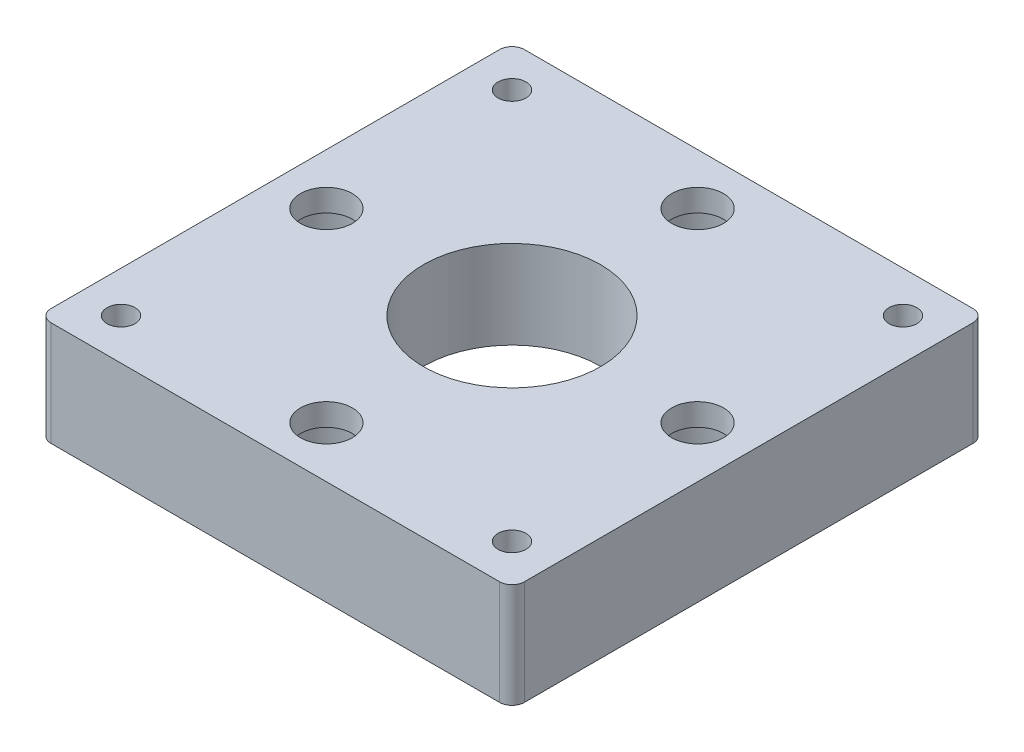
ISO-10303-21;
HEADER;
FILE_DESCRIPTION(('STEP AP214'),'2;1');
FILE_NAME('part.step','',(''),(''),'','','');
FILE_SCHEMA(('AUTOMOTIVE_DESIGN { 1 0 10303 214 1 1 1 1 }'));
ENDSEC;
DATA;
#1=APPLICATION_CONTEXT('core data for automotive mechanical design processes');
#2=APPLICATION_PROTOCOL_DEFINITION('international standard','automotive_design',2000,#1);
#3=PRODUCT_CONTEXT('',#1,'mechanical');
#4=PRODUCT('Part','Part','',(#3));
#5=PRODUCT_RELATED_PRODUCT_CATEGORY('part','',(#4));
#6=PRODUCT_DEFINITION_FORMATION('','',#4);
#7=PRODUCT_DEFINITION_CONTEXT('part definition',#1,'design');
#8=PRODUCT_DEFINITION('design','',#6,#7);
#9=PRODUCT_DEFINITION_SHAPE('','',#8);
#10=(LENGTH_UNIT() NAMED_UNIT(*) SI_UNIT(.MILLI.,.METRE.));
#11=(NAMED_UNIT(*) PLANE_ANGLE_UNIT() SI_UNIT($,.RADIAN.));
#12=(NAMED_UNIT(*) SI_UNIT($,.STERADIAN.) SOLID_ANGLE_UNIT());
#13=UNCERTAINTY_MEASURE_WITH_UNIT(LENGTH_MEASURE(1.E-05),#10,'distance_accuracy_value','');
#14=(GEOMETRIC_REPRESENTATION_CONTEXT(3) GLOBAL_UNCERTAINTY_ASSIGNED_CONTEXT((#13)) GLOBAL_UNIT_ASSIGNED_CONTEXT((#10,
#11,#12)) REPRESENTATION_CONTEXT('',''));
#15=CARTESIAN_POINT('',(0.,0.,0.));
#16=DIRECTION('',(0.,0.,1.));
#17=DIRECTION('',(1.,0.,0.));
#18=AXIS2_PLACEMENT_3D('',#15,#16,#17);
#19=CARTESIAN_POINT('',(0.,2.,0.));
#20=DIRECTION('',(0.,-1.,0.));
#21=DIRECTION('',(0.,0.,-1.));
#22=AXIS2_PLACEMENT_3D('',#19,#20,#21);
#23=CYLINDRICAL_SURFACE('',#22,19.);
#24=CARTESIAN_POINT('',(0.,2.,0.));
#25=DIRECTION('',(0.,-1.,0.));
#26=DIRECTION('',(0.,0.,-1.));
#27=AXIS2_PLACEMENT_3D('',#24,#25,#26);
#28=CIRCLE('',#27,19.);
#29=CARTESIAN_POINT('',(-3.83616697126879,2.,18.6087028824834));
#30=VERTEX_POINT('',#29);
#31=CARTESIAN_POINT('',(-18.6087028824833,2.,3.83616697126909));
#32=VERTEX_POINT('',#31);
#33=EDGE_CURVE('E179',#30,#32,#28,.T.);
#34=ORIENTED_EDGE('',*,*,#33,.F.);
#35=DIRECTION('',(0.,-1.,0.));
#36=VECTOR('',#35,1.);
#37=CARTESIAN_POINT('',(-3.83616697126879,5.,18.6087028824834));
#38=LINE('',#37,#36);
#39=CARTESIAN_POINT('',(-3.83616697126878,0.,18.6087028824834));
#40=VERTEX_POINT('',#39);
#41=EDGE_CURVE('E55',#30,#40,#38,.T.);
#42=ORIENTED_EDGE('',*,*,#41,.T.);
#43=CARTESIAN_POINT('',(0.,0.,0.));
#44=DIRECTION('',(0.,-1.,0.));
#45=DIRECTION('',(0.,0.,-1.));
#46=AXIS2_PLACEMENT_3D('',#43,#44,#45);
#47=CIRCLE('',#46,19.);
#48=CARTESIAN_POINT('',(-18.6087028824833,0.,3.8361669712691));
#49=VERTEX_POINT('',#48);
#50=EDGE_CURVE('E182',#40,#49,#47,.T.);
#51=ORIENTED_EDGE('',*,*,#50,.T.);
#52=DIRECTION('',(0.,-1.,0.));
#53=VECTOR('',#52,1.);
#54=CARTESIAN_POINT('',(-18.6087028824833,5.,3.8361669712691));
#55=LINE('',#54,#53);
#56=EDGE_CURVE('E211',#49,#32,#55,.F.);
#57=ORIENTED_EDGE('',*,*,#56,.T.);
#58=EDGE_LOOP('',(#34,#42,#51,#57));
#59=FACE_BOUND('',#58,.T.);
#60=ADVANCED_FACE('F33',(#59),#23,.F.);
#61=CARTESIAN_POINT('',(-18.6087028824834,2.,-3.83616697126883));
#62=VERTEX_POINT('',#61);
#63=CARTESIAN_POINT('',(-3.83616697126905,2.,-18.6087028824834));
#64=VERTEX_POINT('',#63);
#65=EDGE_CURVE('E174',#62,#64,#28,.T.);
#66=ORIENTED_EDGE('',*,*,#65,.F.);
#67=DIRECTION('',(0.,-1.,0.));
#68=VECTOR('',#67,1.);
#69=CARTESIAN_POINT('',(-18.6087028824834,5.,-3.83616697126884));
#70=LINE('',#69,#68);
#71=CARTESIAN_POINT('',(-18.6087028824834,0.,-3.83616697126884));
#72=VERTEX_POINT('',#71);
#73=EDGE_CURVE('E48',#62,#72,#70,.T.);
#74=ORIENTED_EDGE('',*,*,#73,.T.);
#75=CARTESIAN_POINT('',(-3.83616697126904,0.,-18.6087028824834));
#76=VERTEX_POINT('',#75);
#77=EDGE_CURVE('E177',#72,#76,#47,.T.);
#78=ORIENTED_EDGE('',*,*,#77,.T.);
#79=DIRECTION('',(0.,-1.,0.));
#80=VECTOR('',#79,1.);
#81=CARTESIAN_POINT('',(-3.83616697126904,5.,-18.6087028824834));
#82=LINE('',#81,#80);
#83=EDGE_CURVE('E150',#76,#64,#82,.F.);
#84=ORIENTED_EDGE('',*,*,#83,.T.);
#85=EDGE_LOOP('',(#66,#74,#78,#84));
#86=FACE_BOUND('',#85,.T.);
#87=ADVANCED_FACE('F348',(#86),#23,.F.);
#88=CARTESIAN_POINT('',(18.6087028824834,0.,3.83616697126897));
#89=VERTEX_POINT('',#88);
#90=CARTESIAN_POINT('',(3.83616697126917,0.,18.6087028824833));
#91=VERTEX_POINT('',#90);
#92=EDGE_CURVE('E175',#89,#91,#47,.T.);
#93=ORIENTED_EDGE('',*,*,#92,.T.);
#94=DIRECTION('',(0.,-1.,0.));
#95=VECTOR('',#94,1.);
#96=CARTESIAN_POINT('',(3.83616697126917,5.,18.6087028824833));
#97=LINE('',#96,#95);
#98=CARTESIAN_POINT('',(3.83616697126918,2.,18.6087028824833));
#99=VERTEX_POINT('',#98);
#100=EDGE_CURVE('E215',#91,#99,#97,.F.);
#101=ORIENTED_EDGE('',*,*,#100,.T.);
#102=CARTESIAN_POINT('',(18.6087028824834,2.,3.83616697126896));
#103=VERTEX_POINT('',#102);
#104=EDGE_CURVE('E197',#103,#99,#28,.T.);
#105=ORIENTED_EDGE('',*,*,#104,.F.);
#106=DIRECTION('',(0.,-1.,0.));
#107=VECTOR('',#106,1.);
#108=CARTESIAN_POINT('',(18.6087028824834,5.,3.83616697126897));
#109=LINE('',#108,#107);
#110=EDGE_CURVE('E213',#103,#89,#109,.T.);
#111=ORIENTED_EDGE('',*,*,#110,.T.);
#112=EDGE_LOOP('',(#93,#101,#105,#111));
#113=FACE_BOUND('',#112,.T.);
#114=ADVANCED_FACE('F222',(#113),#23,.F.);
#115=CARTESIAN_POINT('',(27.25,12.7,-27.25));
#116=DIRECTION('',(0.,-1.,0.));
#117=DIRECTION('',(0.,0.,-1.));
#118=AXIS2_PLACEMENT_3D('',#115,#116,#117);
#119=CYLINDRICAL_SURFACE('',#118,1.5);
#120=CARTESIAN_POINT('',(27.25,0.,-27.25));
#121=DIRECTION('',(0.,1.,0.));
#122=DIRECTION('',(0.,0.,1.));
#123=AXIS2_PLACEMENT_3D('',#120,#121,#122);
#124=CIRCLE('',#123,1.5);
#125=CARTESIAN_POINT('',(28.75,0.,-27.25));
#126=VERTEX_POINT('',#125);
#127=CARTESIAN_POINT('',(27.25,0.,-28.75));
#128=VERTEX_POINT('',#127);
#129=EDGE_CURVE('E290',#126,#128,#124,.T.);
#130=ORIENTED_EDGE('',*,*,#129,.T.);
#131=DIRECTION('',(0.,-1.,0.));
#132=VECTOR('',#131,1.);
#133=CARTESIAN_POINT('',(27.25,12.7,-28.75));
#134=LINE('',#133,#132);
#135=CARTESIAN_POINT('',(27.25,12.7,-28.75));
#136=VERTEX_POINT('',#135);
#137=EDGE_CURVE('E248',#136,#128,#134,.T.);
#138=ORIENTED_EDGE('',*,*,#137,.F.);
#139=CARTESIAN_POINT('',(27.25,12.7,-27.25));
#140=DIRECTION('',(0.,1.,0.));
#141=DIRECTION('',(0.,0.,1.));
#142=AXIS2_PLACEMENT_3D('',#139,#140,#141);
#143=CIRCLE('',#142,1.5);
#144=CARTESIAN_POINT('',(28.75,12.7,-27.25));
#145=VERTEX_POINT('',#144);
#146=EDGE_CURVE('E273',#145,#136,#143,.T.);
#147=ORIENTED_EDGE('',*,*,#146,.F.);
#148=DIRECTION('',(0.,-1.,0.));
#149=VECTOR('',#148,1.);
#150=CARTESIAN_POINT('',(28.75,12.7,-27.25));
#151=LINE('',#150,#149);
#152=EDGE_CURVE('E267',#145,#126,#151,.T.);
#153=ORIENTED_EDGE('',*,*,#152,.T.);
#154=EDGE_LOOP('',(#130,#138,#147,#153));
#155=FACE_BOUND('',#154,.T.);
#156=ADVANCED_FACE('F35',(#155),#119,.T.);
#157=CARTESIAN_POINT('',(27.25,12.7,-28.75));
#158=DIRECTION('',(0.,0.,1.));
#159=DIRECTION('',(1.,0.,0.));
#160=AXIS2_PLACEMENT_3D('',#157,#158,#159);
#161=PLANE('',#160);
#162=DIRECTION('',(-1.,0.,0.));
#163=VECTOR('',#162,1.);
#164=CARTESIAN_POINT('',(27.25,0.,-28.75));
#165=LINE('',#164,#163);
#166=CARTESIAN_POINT('',(-27.25,0.,-28.75));
#167=VERTEX_POINT('',#166);
#168=EDGE_CURVE('E287',#128,#167,#165,.T.);
#169=ORIENTED_EDGE('',*,*,#168,.T.);
#170=DIRECTION('',(0.,-1.,0.));
#171=VECTOR('',#170,1.);
#172=CARTESIAN_POINT('',(-27.25,12.7,-28.75));
#173=LINE('',#172,#171);
#174=CARTESIAN_POINT('',(-27.25,12.7,-28.75));
#175=VERTEX_POINT('',#174);
#176=EDGE_CURVE('E253',#175,#167,#173,.T.);
#177=ORIENTED_EDGE('',*,*,#176,.F.);
#178=DIRECTION('',(-1.,0.,0.));
#179=VECTOR('',#178,1.);
#180=CARTESIAN_POINT('',(27.25,12.7,-28.75));
#181=LINE('',#180,#179);
#182=EDGE_CURVE('E307',#136,#175,#181,.T.);
#183=ORIENTED_EDGE('',*,*,#182,.F.);
#184=ORIENTED_EDGE('',*,*,#137,.T.);
#185=EDGE_LOOP('',(#169,#177,#183,#184));
#186=FACE_BOUND('',#185,.T.);
#187=ADVANCED_FACE('F405',(#186),#161,.F.);
#188=CARTESIAN_POINT('',(-27.25,12.7,-27.25));
#189=DIRECTION('',(0.,-1.,0.));
#190=DIRECTION('',(0.,0.,-1.));
#191=AXIS2_PLACEMENT_3D('',#188,#189,#190);
#192=CYLINDRICAL_SURFACE('',#191,1.50000000000001);
#193=CARTESIAN_POINT('',(-27.25,0.,-27.25));
#194=DIRECTION('',(0.,-1.,0.));
#195=DIRECTION('',(0.,0.,-1.));
#196=AXIS2_PLACEMENT_3D('',#193,#194,#195);
#197=CIRCLE('',#196,1.50000000000001);
#198=CARTESIAN_POINT('',(-28.75,0.,-27.25));
#199=VERTEX_POINT('',#198);
#200=EDGE_CURVE('E284',#199,#167,#197,.T.);
#201=ORIENTED_EDGE('',*,*,#200,.F.);
#202=DIRECTION('',(0.,-1.,0.));
#203=VECTOR('',#202,1.);
#204=CARTESIAN_POINT('',(-28.75,12.7,-27.25));
#205=LINE('',#204,#203);
#206=CARTESIAN_POINT('',(-28.75,12.7,-27.25));
#207=VERTEX_POINT('',#206);
#208=EDGE_CURVE('E255',#207,#199,#205,.T.);
#209=ORIENTED_EDGE('',*,*,#208,.F.);
#210=CARTESIAN_POINT('',(-27.25,12.7,-27.25));
#211=DIRECTION('',(0.,-1.,0.));
#212=DIRECTION('',(0.,0.,-1.));
#213=AXIS2_PLACEMENT_3D('',#210,#211,#212);
#214=CIRCLE('',#213,1.50000000000001);
#215=EDGE_CURVE('E304',#207,#175,#214,.T.);
#216=ORIENTED_EDGE('',*,*,#215,.T.);
#217=ORIENTED_EDGE('',*,*,#176,.T.);
#218=EDGE_LOOP('',(#201,#209,#216,#217));
#219=FACE_BOUND('',#218,.T.);
#220=ADVANCED_FACE('F401',(#219),#192,.T.);
#221=CARTESIAN_POINT('',(-28.75,12.7,-27.25));
#222=DIRECTION('',(1.,0.,0.));
#223=DIRECTION('',(0.,0.,-1.));
#224=AXIS2_PLACEMENT_3D('',#221,#222,#223);
#225=PLANE('',#224);
#226=DIRECTION('',(0.,0.,1.));
#227=VECTOR('',#226,1.);
#228=CARTESIAN_POINT('',(-28.75,0.,-27.25));
#229=LINE('',#228,#227);
#230=CARTESIAN_POINT('',(-28.75,0.,27.25));
#231=VERTEX_POINT('',#230);
#232=EDGE_CURVE('E281',#199,#231,#229,.T.);
#233=ORIENTED_EDGE('',*,*,#232,.T.);
#234=DIRECTION('',(0.,-1.,0.));
#235=VECTOR('',#234,1.);
#236=CARTESIAN_POINT('',(-28.75,12.7,27.25));
#237=LINE('',#236,#235);
#238=CARTESIAN_POINT('',(-28.75,12.7,27.25));
#239=VERTEX_POINT('',#238);
#240=EDGE_CURVE('E257',#239,#231,#237,.T.);
#241=ORIENTED_EDGE('',*,*,#240,.F.);
#242=DIRECTION('',(0.,0.,1.));
#243=VECTOR('',#242,1.);
#244=CARTESIAN_POINT('',(-28.75,12.7,-27.25));
#245=LINE('',#244,#243);
#246=EDGE_CURVE('E302',#207,#239,#245,.T.);
#247=ORIENTED_EDGE('',*,*,#246,.F.);
#248=ORIENTED_EDGE('',*,*,#208,.T.);
#249=EDGE_LOOP('',(#233,#241,#247,#248));
#250=FACE_BOUND('',#249,.T.);
#251=ADVANCED_FACE('F398',(#250),#225,.F.);
#252=CARTESIAN_POINT('',(-27.25,12.7,27.25));
#253=DIRECTION('',(0.,-1.,0.));
#254=DIRECTION('',(0.,0.,-1.));
#255=AXIS2_PLACEMENT_3D('',#252,#253,#254);
#256=CYLINDRICAL_SURFACE('',#255,1.5);
#257=CARTESIAN_POINT('',(-27.25,0.,27.25));
#258=DIRECTION('',(0.,-1.,0.));
#259=DIRECTION('',(0.,0.,-1.));
#260=AXIS2_PLACEMENT_3D('',#257,#258,#259);
#261=CIRCLE('',#260,1.5);
#262=CARTESIAN_POINT('',(-27.25,0.,28.75));
#263=VERTEX_POINT('',#262);
#264=EDGE_CURVE('E278',#263,#231,#261,.T.);
#265=ORIENTED_EDGE('',*,*,#264,.F.);
#266=DIRECTION('',(0.,-1.,0.));
#267=VECTOR('',#266,1.);
#268=CARTESIAN_POINT('',(-27.25,12.7,28.75));
#269=LINE('',#268,#267);
#270=CARTESIAN_POINT('',(-27.25,12.7,28.75));
#271=VERTEX_POINT('',#270);
#272=EDGE_CURVE('E259',#271,#263,#269,.T.);
#273=ORIENTED_EDGE('',*,*,#272,.F.);
#274=CARTESIAN_POINT('',(-27.25,12.7,27.25));
#275=DIRECTION('',(0.,-1.,0.));
#276=DIRECTION('',(0.,0.,-1.));
#277=AXIS2_PLACEMENT_3D('',#274,#275,#276);
#278=CIRCLE('',#277,1.5);
#279=EDGE_CURVE('E299',#271,#239,#278,.T.);
#280=ORIENTED_EDGE('',*,*,#279,.T.);
#281=ORIENTED_EDGE('',*,*,#240,.T.);
#282=EDGE_LOOP('',(#265,#273,#280,#281));
#283=FACE_BOUND('',#282,.T.);
#284=ADVANCED_FACE('F392',(#283),#256,.T.);
#285=CARTESIAN_POINT('',(-27.25,12.7,28.75));
#286=DIRECTION('',(0.,0.,-1.));
#287=DIRECTION('',(-1.,0.,0.));
#288=AXIS2_PLACEMENT_3D('',#285,#286,#287);
#289=PLANE('',#288);
#290=DIRECTION('',(1.,0.,0.));
#291=VECTOR('',#290,1.);
#292=CARTESIAN_POINT('',(-27.25,0.,28.75));
#293=LINE('',#292,#291);
#294=CARTESIAN_POINT('',(27.25,0.,28.75));
#295=VERTEX_POINT('',#294);
#296=EDGE_CURVE('E276',#263,#295,#293,.T.);
#297=ORIENTED_EDGE('',*,*,#296,.T.);
#298=DIRECTION('',(0.,-1.,0.));
#299=VECTOR('',#298,1.);
#300=CARTESIAN_POINT('',(27.25,12.7,28.75));
#301=LINE('',#300,#299);
#302=CARTESIAN_POINT('',(27.25,12.7,28.75));
#303=VERTEX_POINT('',#302);
#304=EDGE_CURVE('E261',#303,#295,#301,.T.);
#305=ORIENTED_EDGE('',*,*,#304,.F.);
#306=DIRECTION('',(1.,0.,0.));
#307=VECTOR('',#306,1.);
#308=CARTESIAN_POINT('',(-27.25,12.7,28.75));
#309=LINE('',#308,#307);
#310=EDGE_CURVE('E297',#271,#303,#309,.T.);
#311=ORIENTED_EDGE('',*,*,#310,.F.);
#312=ORIENTED_EDGE('',*,*,#272,.T.);
#313=EDGE_LOOP('',(#297,#305,#311,#312));
#314=FACE_BOUND('',#313,.T.);
#315=ADVANCED_FACE('F407',(#314),#289,.F.);
#316=CARTESIAN_POINT('',(27.25,12.7,27.25));
#317=DIRECTION('',(0.,-1.,0.));
#318=DIRECTION('',(0.,0.,-1.));
#319=AXIS2_PLACEMENT_3D('',#316,#317,#318);
#320=CYLINDRICAL_SURFACE('',#319,1.5);
#321=CARTESIAN_POINT('',(27.25,0.,27.25));
#322=DIRECTION('',(0.,1.,0.));
#323=DIRECTION('',(0.,0.,1.));
#324=AXIS2_PLACEMENT_3D('',#321,#322,#323);
#325=CIRCLE('',#324,1.5);
#326=CARTESIAN_POINT('',(28.75,0.,27.25));
#327=VERTEX_POINT('',#326);
#328=EDGE_CURVE('E274',#295,#327,#325,.T.);
#329=ORIENTED_EDGE('',*,*,#328,.T.);
#330=DIRECTION('',(0.,-1.,0.));
#331=VECTOR('',#330,1.);
#332=CARTESIAN_POINT('',(28.75,12.7,27.25));
#333=LINE('',#332,#331);
#334=CARTESIAN_POINT('',(28.75,12.7,27.25));
#335=VERTEX_POINT('',#334);
#336=EDGE_CURVE('E264',#335,#327,#333,.T.);
#337=ORIENTED_EDGE('',*,*,#336,.F.);
#338=CARTESIAN_POINT('',(27.25,12.7,27.25));
#339=DIRECTION('',(0.,1.,0.));
#340=DIRECTION('',(0.,0.,1.));
#341=AXIS2_PLACEMENT_3D('',#338,#339,#340);
#342=CIRCLE('',#341,1.5);
#343=EDGE_CURVE('E295',#303,#335,#342,.T.);
#344=ORIENTED_EDGE('',*,*,#343,.F.);
#345=ORIENTED_EDGE('',*,*,#304,.T.);
#346=EDGE_LOOP('',(#329,#337,#344,#345));
#347=FACE_BOUND('',#346,.T.);
#348=ADVANCED_FACE('F385',(#347),#320,.T.);
#349=CARTESIAN_POINT('',(28.75,12.7,27.25));
#350=DIRECTION('',(-1.,0.,0.));
#351=DIRECTION('',(0.,0.,1.));
#352=AXIS2_PLACEMENT_3D('',#349,#350,#351);
#353=PLANE('',#352);
#354=DIRECTION('',(0.,0.,-1.));
#355=VECTOR('',#354,1.);
#356=CARTESIAN_POINT('',(28.75,0.,27.25));
#357=LINE('',#356,#355);
#358=EDGE_CURVE('E271',#327,#126,#357,.T.);
#359=ORIENTED_EDGE('',*,*,#358,.T.);
#360=ORIENTED_EDGE('',*,*,#152,.F.);
#361=DIRECTION('',(0.,0.,-1.));
#362=VECTOR('',#361,1.);
#363=CARTESIAN_POINT('',(28.75,12.7,27.25));
#364=LINE('',#363,#362);
#365=EDGE_CURVE('E270',#335,#145,#364,.T.);
#366=ORIENTED_EDGE('',*,*,#365,.F.);
#367=ORIENTED_EDGE('',*,*,#336,.T.);
#368=EDGE_LOOP('',(#359,#360,#366,#367));
#369=FACE_BOUND('',#368,.T.);
#370=ADVANCED_FACE('F381',(#369),#353,.F.);
#371=CARTESIAN_POINT('',(27.25,12.7,-27.25));
#372=DIRECTION('',(0.,1.,0.));
#373=DIRECTION('',(0.,0.,1.));
#374=AXIS2_PLACEMENT_3D('',#371,#372,#373);
#375=PLANE('',#374);
#376=CARTESIAN_POINT('',(22.55,12.7,0.));
#377=DIRECTION('',(0.,-1.,0.));
#378=DIRECTION('',(0.,0.,-1.));
#379=AXIS2_PLACEMENT_3D('',#376,#377,#378);
#380=CIRCLE('',#379,3.15);
#381=CARTESIAN_POINT('',(22.55,12.7,-3.15));
#382=VERTEX_POINT('',#381);
#383=EDGE_CURVE('E242',#382,#382,#380,.T.);
#384=ORIENTED_EDGE('',*,*,#383,.T.);
#385=EDGE_LOOP('',(#384));
#386=FACE_BOUND('',#385,.T.);
#387=CARTESIAN_POINT('',(0.,12.7,-22.55));
#388=DIRECTION('',(0.,-1.,0.));
#389=DIRECTION('',(0.,0.,-1.));
#390=AXIS2_PLACEMENT_3D('',#387,#388,#389);
#391=CIRCLE('',#390,3.15);
#392=CARTESIAN_POINT('',(0.,12.7,-25.7));
#393=VERTEX_POINT('',#392);
#394=EDGE_CURVE('E654',#393,#393,#391,.T.);
#395=ORIENTED_EDGE('',*,*,#394,.T.);
#396=EDGE_LOOP('',(#395));
#397=FACE_BOUND('',#396,.T.);
#398=CARTESIAN_POINT('',(-22.55,12.7,1.57465808381825E-13));
#399=DIRECTION('',(0.,-1.,0.));
#400=DIRECTION('',(0.,0.,-1.));
#401=AXIS2_PLACEMENT_3D('',#398,#399,#400);
#402=CIRCLE('',#401,3.15);
#403=CARTESIAN_POINT('',(-22.55,12.7,-3.14999999999984));
#404=VERTEX_POINT('',#403);
#405=EDGE_CURVE('E655',#404,#404,#402,.T.);
#406=ORIENTED_EDGE('',*,*,#405,.T.);
#407=EDGE_LOOP('',(#406));
#408=FACE_BOUND('',#407,.T.);
#409=CARTESIAN_POINT('',(2.36198712572738E-13,12.7,22.55));
#410=DIRECTION('',(0.,-1.,0.));
#411=DIRECTION('',(0.,0.,-1.));
#412=AXIS2_PLACEMENT_3D('',#409,#410,#411);
#413=CIRCLE('',#412,3.15);
#414=CARTESIAN_POINT('',(2.36198712572738E-13,12.7,19.4));
#415=VERTEX_POINT('',#414);
#416=EDGE_CURVE('E667',#415,#415,#413,.T.);
#417=ORIENTED_EDGE('',*,*,#416,.T.);
#418=EDGE_LOOP('',(#417));
#419=FACE_BOUND('',#418,.T.);
#420=CARTESIAN_POINT('',(0.,12.7,0.));
#421=DIRECTION('',(0.,-1.,0.));
#422=DIRECTION('',(0.,0.,-1.));
#423=AXIS2_PLACEMENT_3D('',#420,#421,#422);
#424=CIRCLE('',#423,10.75);
#425=CARTESIAN_POINT('',(0.,12.7,-10.75));
#426=VERTEX_POINT('',#425);
#427=EDGE_CURVE('E184',#426,#426,#424,.T.);
#428=ORIENTED_EDGE('',*,*,#427,.T.);
#429=EDGE_LOOP('',(#428));
#430=FACE_BOUND('',#429,.T.);
#431=CARTESIAN_POINT('',(-23.75,12.7,-23.7500000000003));
#432=DIRECTION('',(0.,1.,0.));
#433=DIRECTION('',(0.,0.,1.));
#434=AXIS2_PLACEMENT_3D('',#431,#432,#433);
#435=CIRCLE('',#434,1.69379628197264);
#436=CARTESIAN_POINT('',(-23.75,12.7,-22.0562037180276));
#437=VERTEX_POINT('',#436);
#438=EDGE_CURVE('E293',#437,#437,#435,.F.);
#439=ORIENTED_EDGE('',*,*,#438,.T.);
#440=EDGE_LOOP('',(#439));
#441=FACE_BOUND('',#440,.T.);
#442=CARTESIAN_POINT('',(23.75,12.7,23.7500000000003));
#443=DIRECTION('',(0.,1.,0.));
#444=DIRECTION('',(0.,0.,1.));
#445=AXIS2_PLACEMENT_3D('',#442,#443,#444);
#446=CIRCLE('',#445,1.69379628197264);
#447=CARTESIAN_POINT('',(23.75,12.7,25.4437962819729));
#448=VERTEX_POINT('',#447);
#449=EDGE_CURVE('E313',#448,#448,#446,.F.);
#450=ORIENTED_EDGE('',*,*,#449,.T.);
#451=EDGE_LOOP('',(#450));
#452=FACE_BOUND('',#451,.T.);
#453=CARTESIAN_POINT('',(-23.75,12.7,23.7500000000003));
#454=DIRECTION('',(0.,1.,0.));
#455=DIRECTION('',(0.,0.,1.));
#456=AXIS2_PLACEMENT_3D('',#453,#454,#455);
#457=CIRCLE('',#456,1.69379628197264);
#458=CARTESIAN_POINT('',(-23.75,12.7,25.4437962819729));
#459=VERTEX_POINT('',#458);
#460=EDGE_CURVE('E316',#459,#459,#457,.F.);
#461=ORIENTED_EDGE('',*,*,#460,.T.);
#462=EDGE_LOOP('',(#461));
#463=FACE_BOUND('',#462,.T.);
#464=CARTESIAN_POINT('',(23.75,12.7,-23.7500000000003));
#465=DIRECTION('',(0.,1.,0.));
#466=DIRECTION('',(0.,0.,1.));
#467=AXIS2_PLACEMENT_3D('',#464,#465,#466);
#468=CIRCLE('',#467,1.69379628197264);
#469=CARTESIAN_POINT('',(23.75,12.7,-22.0562037180276));
#470=VERTEX_POINT('',#469);
#471=EDGE_CURVE('E319',#470,#470,#468,.F.);
#472=ORIENTED_EDGE('',*,*,#471,.T.);
#473=EDGE_LOOP('',(#472));
#474=FACE_BOUND('',#473,.T.);
#475=ORIENTED_EDGE('',*,*,#146,.T.);
#476=ORIENTED_EDGE('',*,*,#182,.T.);
#477=ORIENTED_EDGE('',*,*,#215,.F.);
#478=ORIENTED_EDGE('',*,*,#246,.T.);
#479=ORIENTED_EDGE('',*,*,#279,.F.);
#480=ORIENTED_EDGE('',*,*,#310,.T.);
#481=ORIENTED_EDGE('',*,*,#343,.T.);
#482=ORIENTED_EDGE('',*,*,#365,.T.);
#483=EDGE_LOOP('',(#475,#476,#477,#478,#479,#480,#481,#482));
#484=FACE_BOUND('',#483,.T.);
#485=ADVANCED_FACE('F368',(#386,#397,#408,#419,#430,#441,#452,#463,#474,#484),#375,.T.);
#486=CARTESIAN_POINT('',(27.25,0.,-27.25));
#487=DIRECTION('',(0.,1.,0.));
#488=DIRECTION('',(0.,0.,1.));
#489=AXIS2_PLACEMENT_3D('',#486,#487,#488);
#490=PLANE('',#489);
#491=ORIENTED_EDGE('',*,*,#50,.F.);
#492=CARTESIAN_POINT('',(2.36198712572738E-13,0.,22.55));
#493=DIRECTION('',(0.,-1.,0.));
#494=DIRECTION('',(0.,0.,-1.));
#495=AXIS2_PLACEMENT_3D('',#492,#493,#494);
#496=CIRCLE('',#495,5.5);
#497=EDGE_CURVE('E225',#91,#40,#496,.T.);
#498=ORIENTED_EDGE('',*,*,#497,.F.);
#499=ORIENTED_EDGE('',*,*,#92,.F.);
#500=CARTESIAN_POINT('',(22.55,0.,0.));
#501=DIRECTION('',(0.,-1.,0.));
#502=DIRECTION('',(0.,0.,-1.));
#503=AXIS2_PLACEMENT_3D('',#500,#501,#502);
#504=CIRCLE('',#503,5.5);
#505=CARTESIAN_POINT('',(18.6087028824834,0.,-3.83616697126897));
#506=VERTEX_POINT('',#505);
#507=EDGE_CURVE('E173',#506,#89,#504,.T.);
#508=ORIENTED_EDGE('',*,*,#507,.F.);
#509=CARTESIAN_POINT('',(3.83616697126891,0.,-18.6087028824834));
#510=VERTEX_POINT('',#509);
#511=EDGE_CURVE('E163',#510,#506,#47,.T.);
#512=ORIENTED_EDGE('',*,*,#511,.F.);
#513=CARTESIAN_POINT('',(0.,0.,-22.55));
#514=DIRECTION('',(0.,-1.,0.));
#515=DIRECTION('',(0.,0.,-1.));
#516=AXIS2_PLACEMENT_3D('',#513,#514,#515);
#517=CIRCLE('',#516,5.5);
#518=EDGE_CURVE('E144',#76,#510,#517,.T.);
#519=ORIENTED_EDGE('',*,*,#518,.F.);
#520=ORIENTED_EDGE('',*,*,#77,.F.);
#521=CARTESIAN_POINT('',(-22.55,0.,1.57465808381825E-13));
#522=DIRECTION('',(0.,-1.,0.));
#523=DIRECTION('',(0.,0.,-1.));
#524=AXIS2_PLACEMENT_3D('',#521,#522,#523);
#525=CIRCLE('',#524,5.49999999999999);
#526=EDGE_CURVE('E227',#49,#72,#525,.T.);
#527=ORIENTED_EDGE('',*,*,#526,.F.);
#528=EDGE_LOOP('',(#491,#498,#499,#508,#512,#519,#520,#527));
#529=FACE_BOUND('',#528,.T.);
#530=CARTESIAN_POINT('',(-23.75,0.,-23.7500000000003));
#531=DIRECTION('',(0.,1.,0.));
#532=DIRECTION('',(0.,0.,1.));
#533=AXIS2_PLACEMENT_3D('',#530,#531,#532);
#534=CIRCLE('',#533,1.69379628197264);
#535=CARTESIAN_POINT('',(-23.75,0.,-22.0562037180276));
#536=VERTEX_POINT('',#535);
#537=EDGE_CURVE('E325',#536,#536,#534,.T.);
#538=ORIENTED_EDGE('',*,*,#537,.T.);
#539=EDGE_LOOP('',(#538));
#540=FACE_BOUND('',#539,.T.);
#541=CARTESIAN_POINT('',(23.75,0.,23.7500000000003));
#542=DIRECTION('',(0.,1.,0.));
#543=DIRECTION('',(0.,0.,1.));
#544=AXIS2_PLACEMENT_3D('',#541,#542,#543);
#545=CIRCLE('',#544,1.69379628197264);
#546=CARTESIAN_POINT('',(23.75,0.,25.4437962819729));
#547=VERTEX_POINT('',#546);
#548=EDGE_CURVE('E201',#547,#547,#545,.T.);
#549=ORIENTED_EDGE('',*,*,#548,.T.);
#550=EDGE_LOOP('',(#549));
#551=FACE_BOUND('',#550,.T.);
#552=CARTESIAN_POINT('',(-23.75,0.,23.7500000000003));
#553=DIRECTION('',(0.,1.,0.));
#554=DIRECTION('',(0.,0.,-1.));
#555=AXIS2_PLACEMENT_3D('',#552,#553,#554);
#556=CIRCLE('',#555,1.69379628197264);
#557=CARTESIAN_POINT('',(-23.75,0.,22.0562037180276));
#558=VERTEX_POINT('',#557);
#559=EDGE_CURVE('E196',#558,#558,#556,.T.);
#560=ORIENTED_EDGE('',*,*,#559,.T.);
#561=EDGE_LOOP('',(#560));
#562=FACE_BOUND('',#561,.T.);
#563=CARTESIAN_POINT('',(23.75,0.,-23.7500000000003));
#564=DIRECTION('',(0.,1.,0.));
#565=DIRECTION('',(0.,0.,-1.));
#566=AXIS2_PLACEMENT_3D('',#563,#564,#565);
#567=CIRCLE('',#566,1.69379628197264);
#568=CARTESIAN_POINT('',(23.75,0.,-25.4437962819729));
#569=VERTEX_POINT('',#568);
#570=EDGE_CURVE('E322',#569,#569,#567,.T.);
#571=ORIENTED_EDGE('',*,*,#570,.T.);
#572=EDGE_LOOP('',(#571));
#573=FACE_BOUND('',#572,.T.);
#574=ORIENTED_EDGE('',*,*,#129,.F.);
#575=ORIENTED_EDGE('',*,*,#358,.F.);
#576=ORIENTED_EDGE('',*,*,#328,.F.);
#577=ORIENTED_EDGE('',*,*,#296,.F.);
#578=ORIENTED_EDGE('',*,*,#264,.T.);
#579=ORIENTED_EDGE('',*,*,#232,.F.);
#580=ORIENTED_EDGE('',*,*,#200,.T.);
#581=ORIENTED_EDGE('',*,*,#168,.F.);
#582=EDGE_LOOP('',(#574,#575,#576,#577,#578,#579,#580,#581));
#583=FACE_BOUND('',#582,.T.);
#584=ADVANCED_FACE('F170',(#529,#540,#551,#562,#573,#583),#490,.F.);
#585=CARTESIAN_POINT('',(23.75,29.7,-23.7500000000003));
#586=DIRECTION('',(0.,-1.,0.));
#587=DIRECTION('',(0.,0.,-1.));
#588=AXIS2_PLACEMENT_3D('',#585,#586,#587);
#589=CYLINDRICAL_SURFACE('',#588,1.69379628197264);
#590=ORIENTED_EDGE('',*,*,#471,.F.);
#591=EDGE_LOOP('',(#590));
#592=FACE_BOUND('',#591,.T.);
#593=ORIENTED_EDGE('',*,*,#570,.F.);
#594=EDGE_LOOP('',(#593));
#595=FACE_BOUND('',#594,.T.);
#596=ADVANCED_FACE('F355',(#592,#595),#589,.F.);
#597=CARTESIAN_POINT('',(-23.75,29.7,23.7500000000003));
#598=DIRECTION('',(0.,-1.,0.));
#599=DIRECTION('',(0.,0.,-1.));
#600=AXIS2_PLACEMENT_3D('',#597,#598,#599);
#601=CYLINDRICAL_SURFACE('',#600,1.69379628197264);
#602=ORIENTED_EDGE('',*,*,#460,.F.);
#603=EDGE_LOOP('',(#602));
#604=FACE_BOUND('',#603,.T.);
#605=ORIENTED_EDGE('',*,*,#559,.F.);
#606=EDGE_LOOP('',(#605));
#607=FACE_BOUND('',#606,.T.);
#608=ADVANCED_FACE('F342',(#604,#607),#601,.F.);
#609=CARTESIAN_POINT('',(23.75,29.7,23.7500000000003));
#610=DIRECTION('',(0.,-1.,0.));
#611=DIRECTION('',(0.,0.,-1.));
#612=AXIS2_PLACEMENT_3D('',#609,#610,#611);
#613=CYLINDRICAL_SURFACE('',#612,1.69379628197264);
#614=ORIENTED_EDGE('',*,*,#449,.F.);
#615=EDGE_LOOP('',(#614));
#616=FACE_BOUND('',#615,.T.);
#617=ORIENTED_EDGE('',*,*,#548,.F.);
#618=EDGE_LOOP('',(#617));
#619=FACE_BOUND('',#618,.T.);
#620=ADVANCED_FACE('F334',(#616,#619),#613,.F.);
#621=CARTESIAN_POINT('',(-23.75,29.7,-23.7500000000003));
#622=DIRECTION('',(0.,-1.,0.));
#623=DIRECTION('',(0.,0.,-1.));
#624=AXIS2_PLACEMENT_3D('',#621,#622,#623);
#625=CYLINDRICAL_SURFACE('',#624,1.69379628197264);
#626=ORIENTED_EDGE('',*,*,#438,.F.);
#627=EDGE_LOOP('',(#626));
#628=FACE_BOUND('',#627,.T.);
#629=ORIENTED_EDGE('',*,*,#537,.F.);
#630=EDGE_LOOP('',(#629));
#631=FACE_BOUND('',#630,.T.);
#632=ADVANCED_FACE('F332',(#628,#631),#625,.F.);
#633=ORIENTED_EDGE('',*,*,#511,.T.);
#634=DIRECTION('',(0.,-1.,0.));
#635=VECTOR('',#634,1.);
#636=CARTESIAN_POINT('',(18.6087028824834,5.,-3.83616697126897));
#637=LINE('',#636,#635);
#638=CARTESIAN_POINT('',(18.6087028824834,2.,-3.83616697126896));
#639=VERTEX_POINT('',#638);
#640=EDGE_CURVE('E166',#506,#639,#637,.F.);
#641=ORIENTED_EDGE('',*,*,#640,.T.);
#642=CARTESIAN_POINT('',(3.83616697126892,2.,-18.6087028824834));
#643=VERTEX_POINT('',#642);
#644=EDGE_CURVE('E165',#643,#639,#28,.T.);
#645=ORIENTED_EDGE('',*,*,#644,.F.);
#646=DIRECTION('',(0.,-1.,0.));
#647=VECTOR('',#646,1.);
#648=CARTESIAN_POINT('',(3.83616697126891,5.,-18.6087028824834));
#649=LINE('',#648,#647);
#650=EDGE_CURVE('E147',#643,#510,#649,.T.);
#651=ORIENTED_EDGE('',*,*,#650,.T.);
#652=EDGE_LOOP('',(#633,#641,#645,#651));
#653=FACE_BOUND('',#652,.T.);
#654=ADVANCED_FACE('F161',(#653),#23,.F.);
#655=CARTESIAN_POINT('',(0.,2.,0.));
#656=DIRECTION('',(0.,-1.,0.));
#657=DIRECTION('',(0.,0.,-1.));
#658=AXIS2_PLACEMENT_3D('',#655,#656,#657);
#659=PLANE('',#658);
#660=CARTESIAN_POINT('',(2.36198712572738E-13,2.,22.55));
#661=DIRECTION('',(0.,-1.,0.));
#662=DIRECTION('',(0.,0.,-1.));
#663=AXIS2_PLACEMENT_3D('',#660,#661,#662);
#664=CIRCLE('',#663,5.5);
#665=EDGE_CURVE('E12',#30,#99,#664,.T.);
#666=ORIENTED_EDGE('',*,*,#665,.F.);
#667=ORIENTED_EDGE('',*,*,#33,.T.);
#668=CARTESIAN_POINT('',(-22.55,2.,1.57465808381825E-13));
#669=DIRECTION('',(0.,-1.,0.));
#670=DIRECTION('',(0.,0.,-1.));
#671=AXIS2_PLACEMENT_3D('',#668,#669,#670);
#672=CIRCLE('',#671,5.49999999999999);
#673=EDGE_CURVE('E41',#62,#32,#672,.T.);
#674=ORIENTED_EDGE('',*,*,#673,.F.);
#675=ORIENTED_EDGE('',*,*,#65,.T.);
#676=CARTESIAN_POINT('',(0.,2.,-22.55));
#677=DIRECTION('',(0.,-1.,0.));
#678=DIRECTION('',(0.,0.,-1.));
#679=AXIS2_PLACEMENT_3D('',#676,#677,#678);
#680=CIRCLE('',#679,5.5);
#681=EDGE_CURVE('E246',#643,#64,#680,.T.);
#682=ORIENTED_EDGE('',*,*,#681,.F.);
#683=ORIENTED_EDGE('',*,*,#644,.T.);
#684=CARTESIAN_POINT('',(22.55,2.,0.));
#685=DIRECTION('',(0.,-1.,0.));
#686=DIRECTION('',(0.,0.,-1.));
#687=AXIS2_PLACEMENT_3D('',#684,#685,#686);
#688=CIRCLE('',#687,5.5);
#689=EDGE_CURVE('E245',#103,#639,#688,.T.);
#690=ORIENTED_EDGE('',*,*,#689,.F.);
#691=ORIENTED_EDGE('',*,*,#104,.T.);
#692=EDGE_LOOP('',(#666,#667,#674,#675,#682,#683,#690,#691));
#693=FACE_BOUND('',#692,.T.);
#694=CARTESIAN_POINT('',(0.,2.,0.));
#695=DIRECTION('',(0.,-1.,0.));
#696=DIRECTION('',(0.,0.,-1.));
#697=AXIS2_PLACEMENT_3D('',#694,#695,#696);
#698=CIRCLE('',#697,10.75);
#699=CARTESIAN_POINT('',(0.,2.,-10.75));
#700=VERTEX_POINT('',#699);
#701=EDGE_CURVE('E188',#700,#700,#698,.T.);
#702=ORIENTED_EDGE('',*,*,#701,.F.);
#703=EDGE_LOOP('',(#702));
#704=FACE_BOUND('',#703,.T.);
#705=ADVANCED_FACE('F206',(#693,#704),#659,.T.);
#706=CARTESIAN_POINT('',(0.,12.7,0.));
#707=DIRECTION('',(0.,-1.,0.));
#708=DIRECTION('',(0.,0.,-1.));
#709=AXIS2_PLACEMENT_3D('',#706,#707,#708);
#710=CYLINDRICAL_SURFACE('',#709,10.75);
#711=ORIENTED_EDGE('',*,*,#427,.F.);
#712=EDGE_LOOP('',(#711));
#713=FACE_BOUND('',#712,.T.);
#714=ORIENTED_EDGE('',*,*,#701,.T.);
#715=EDGE_LOOP('',(#714));
#716=FACE_BOUND('',#715,.T.);
#717=ADVANCED_FACE('F445',(#713,#716),#710,.F.);
#718=CARTESIAN_POINT('',(0.,10.,-22.55));
#719=DIRECTION('',(0.,-1.,0.));
#720=DIRECTION('',(0.,0.,-1.));
#721=AXIS2_PLACEMENT_3D('',#718,#719,#720);
#722=CYLINDRICAL_SURFACE('',#721,5.5);
#723=CARTESIAN_POINT('',(0.,10.,-22.55));
#724=DIRECTION('',(0.,-1.,0.));
#725=DIRECTION('',(0.,0.,-1.));
#726=AXIS2_PLACEMENT_3D('',#723,#724,#725);
#727=CIRCLE('',#726,5.5);
#728=CARTESIAN_POINT('',(0.,10.,-28.05));
#729=VERTEX_POINT('',#728);
#730=EDGE_CURVE('E156',#729,#729,#727,.T.);
#731=ORIENTED_EDGE('',*,*,#730,.F.);
#732=EDGE_LOOP('',(#731));
#733=FACE_BOUND('',#732,.T.);
#734=ORIENTED_EDGE('',*,*,#681,.T.);
#735=ORIENTED_EDGE('',*,*,#83,.F.);
#736=ORIENTED_EDGE('',*,*,#518,.T.);
#737=ORIENTED_EDGE('',*,*,#650,.F.);
#738=EDGE_LOOP('',(#734,#735,#736,#737));
#739=FACE_BOUND('',#738,.T.);
#740=ADVANCED_FACE('F146',(#733,#739),#722,.F.);
#741=CARTESIAN_POINT('',(0.,10.,-22.55));
#742=DIRECTION('',(0.,-1.,0.));
#743=DIRECTION('',(0.,0.,-1.));
#744=AXIS2_PLACEMENT_3D('',#741,#742,#743);
#745=PLANE('',#744);
#746=CARTESIAN_POINT('',(0.,10.,-22.55));
#747=DIRECTION('',(0.,-1.,0.));
#748=DIRECTION('',(0.,0.,-1.));
#749=AXIS2_PLACEMENT_3D('',#746,#747,#748);
#750=CIRCLE('',#749,3.15);
#751=CARTESIAN_POINT('',(0.,10.,-25.7));
#752=VERTEX_POINT('',#751);
#753=EDGE_CURVE('E651',#752,#752,#750,.T.);
#754=ORIENTED_EDGE('',*,*,#753,.F.);
#755=EDGE_LOOP('',(#754));
#756=FACE_BOUND('',#755,.T.);
#757=ORIENTED_EDGE('',*,*,#730,.T.);
#758=EDGE_LOOP('',(#757));
#759=FACE_BOUND('',#758,.T.);
#760=ADVANCED_FACE('F547',(#756,#759),#745,.T.);
#761=CARTESIAN_POINT('',(22.55,10.,0.));
#762=DIRECTION('',(0.,-1.,0.));
#763=DIRECTION('',(0.,0.,-1.));
#764=AXIS2_PLACEMENT_3D('',#761,#762,#763);
#765=CYLINDRICAL_SURFACE('',#764,5.5);
#766=CARTESIAN_POINT('',(22.55,10.,0.));
#767=DIRECTION('',(0.,-1.,0.));
#768=DIRECTION('',(0.,0.,-1.));
#769=AXIS2_PLACEMENT_3D('',#766,#767,#768);
#770=CIRCLE('',#769,5.5);
#771=CARTESIAN_POINT('',(22.55,10.,-5.5));
#772=VERTEX_POINT('',#771);
#773=EDGE_CURVE('E155',#772,#772,#770,.T.);
#774=ORIENTED_EDGE('',*,*,#773,.F.);
#775=EDGE_LOOP('',(#774));
#776=FACE_BOUND('',#775,.T.);
#777=ORIENTED_EDGE('',*,*,#689,.T.);
#778=ORIENTED_EDGE('',*,*,#640,.F.);
#779=ORIENTED_EDGE('',*,*,#507,.T.);
#780=ORIENTED_EDGE('',*,*,#110,.F.);
#781=EDGE_LOOP('',(#777,#778,#779,#780));
#782=FACE_BOUND('',#781,.T.);
#783=ADVANCED_FACE('F244',(#776,#782),#765,.F.);
#784=CARTESIAN_POINT('',(22.55,10.,0.));
#785=DIRECTION('',(0.,-1.,0.));
#786=DIRECTION('',(0.,0.,-1.));
#787=AXIS2_PLACEMENT_3D('',#784,#785,#786);
#788=PLANE('',#787);
#789=CARTESIAN_POINT('',(22.55,10.,0.));
#790=DIRECTION('',(0.,-1.,0.));
#791=DIRECTION('',(0.,0.,-1.));
#792=AXIS2_PLACEMENT_3D('',#789,#790,#791);
#793=CIRCLE('',#792,3.15);
#794=CARTESIAN_POINT('',(22.55,10.,-3.15));
#795=VERTEX_POINT('',#794);
#796=EDGE_CURVE('E658',#795,#795,#793,.T.);
#797=ORIENTED_EDGE('',*,*,#796,.F.);
#798=EDGE_LOOP('',(#797));
#799=FACE_BOUND('',#798,.T.);
#800=ORIENTED_EDGE('',*,*,#773,.T.);
#801=EDGE_LOOP('',(#800));
#802=FACE_BOUND('',#801,.T.);
#803=ADVANCED_FACE('F559',(#799,#802),#788,.T.);
#804=CARTESIAN_POINT('',(-22.55,10.,1.57465808381825E-13));
#805=DIRECTION('',(0.,-1.,0.));
#806=DIRECTION('',(0.,0.,-1.));
#807=AXIS2_PLACEMENT_3D('',#804,#805,#806);
#808=CYLINDRICAL_SURFACE('',#807,5.49999999999999);
#809=CARTESIAN_POINT('',(-22.55,10.,1.57465808381825E-13));
#810=DIRECTION('',(0.,-1.,0.));
#811=DIRECTION('',(0.,0.,-1.));
#812=AXIS2_PLACEMENT_3D('',#809,#810,#811);
#813=CIRCLE('',#812,5.49999999999999);
#814=CARTESIAN_POINT('',(-22.55,10.,-5.49999999999984));
#815=VERTEX_POINT('',#814);
#816=EDGE_CURVE('E231',#815,#815,#813,.T.);
#817=ORIENTED_EDGE('',*,*,#816,.F.);
#818=EDGE_LOOP('',(#817));
#819=FACE_BOUND('',#818,.T.);
#820=ORIENTED_EDGE('',*,*,#673,.T.);
#821=ORIENTED_EDGE('',*,*,#56,.F.);
#822=ORIENTED_EDGE('',*,*,#526,.T.);
#823=ORIENTED_EDGE('',*,*,#73,.F.);
#824=EDGE_LOOP('',(#820,#821,#822,#823));
#825=FACE_BOUND('',#824,.T.);
#826=ADVANCED_FACE('F567',(#819,#825),#808,.F.);
#827=CARTESIAN_POINT('',(-22.55,10.,1.57465808381825E-13));
#828=DIRECTION('',(0.,-1.,0.));
#829=DIRECTION('',(0.,0.,-1.));
#830=AXIS2_PLACEMENT_3D('',#827,#828,#829);
#831=PLANE('',#830);
#832=CARTESIAN_POINT('',(-22.55,10.,1.57465808381825E-13));
#833=DIRECTION('',(0.,-1.,0.));
#834=DIRECTION('',(0.,0.,-1.));
#835=AXIS2_PLACEMENT_3D('',#832,#833,#834);
#836=CIRCLE('',#835,3.15);
#837=CARTESIAN_POINT('',(-22.55,10.,-3.14999999999984));
#838=VERTEX_POINT('',#837);
#839=EDGE_CURVE('E661',#838,#838,#836,.T.);
#840=ORIENTED_EDGE('',*,*,#839,.F.);
#841=EDGE_LOOP('',(#840));
#842=FACE_BOUND('',#841,.T.);
#843=ORIENTED_EDGE('',*,*,#816,.T.);
#844=EDGE_LOOP('',(#843));
#845=FACE_BOUND('',#844,.T.);
#846=ADVANCED_FACE('F571',(#842,#845),#831,.T.);
#847=CARTESIAN_POINT('',(2.36198712572738E-13,10.,22.55));
#848=DIRECTION('',(0.,-1.,0.));
#849=DIRECTION('',(0.,0.,-1.));
#850=AXIS2_PLACEMENT_3D('',#847,#848,#849);
#851=CYLINDRICAL_SURFACE('',#850,5.5);
#852=CARTESIAN_POINT('',(2.36198712572738E-13,10.,22.55));
#853=DIRECTION('',(0.,-1.,0.));
#854=DIRECTION('',(0.,0.,-1.));
#855=AXIS2_PLACEMENT_3D('',#852,#853,#854);
#856=CIRCLE('',#855,5.5);
#857=CARTESIAN_POINT('',(2.36198712572738E-13,10.,17.05));
#858=VERTEX_POINT('',#857);
#859=EDGE_CURVE('E226',#858,#858,#856,.T.);
#860=ORIENTED_EDGE('',*,*,#859,.F.);
#861=EDGE_LOOP('',(#860));
#862=FACE_BOUND('',#861,.T.);
#863=ORIENTED_EDGE('',*,*,#665,.T.);
#864=ORIENTED_EDGE('',*,*,#100,.F.);
#865=ORIENTED_EDGE('',*,*,#497,.T.);
#866=ORIENTED_EDGE('',*,*,#41,.F.);
#867=EDGE_LOOP('',(#863,#864,#865,#866));
#868=FACE_BOUND('',#867,.T.);
#869=ADVANCED_FACE('F224',(#862,#868),#851,.F.);
#870=CARTESIAN_POINT('',(2.36198712572738E-13,10.,22.55));
#871=DIRECTION('',(0.,-1.,0.));
#872=DIRECTION('',(0.,0.,-1.));
#873=AXIS2_PLACEMENT_3D('',#870,#871,#872);
#874=PLANE('',#873);
#875=CARTESIAN_POINT('',(2.36198712572738E-13,10.,22.55));
#876=DIRECTION('',(0.,-1.,0.));
#877=DIRECTION('',(0.,0.,-1.));
#878=AXIS2_PLACEMENT_3D('',#875,#876,#877);
#879=CIRCLE('',#878,3.15);
#880=CARTESIAN_POINT('',(2.36198712572738E-13,10.,19.4));
#881=VERTEX_POINT('',#880);
#882=EDGE_CURVE('E669',#881,#881,#879,.T.);
#883=ORIENTED_EDGE('',*,*,#882,.F.);
#884=EDGE_LOOP('',(#883));
#885=FACE_BOUND('',#884,.T.);
#886=ORIENTED_EDGE('',*,*,#859,.T.);
#887=EDGE_LOOP('',(#886));
#888=FACE_BOUND('',#887,.T.);
#889=ADVANCED_FACE('F582',(#885,#888),#874,.T.);
#890=CARTESIAN_POINT('',(2.36198712572738E-13,12.7,22.55));
#891=DIRECTION('',(0.,-1.,0.));
#892=DIRECTION('',(0.,0.,-1.));
#893=AXIS2_PLACEMENT_3D('',#890,#891,#892);
#894=CYLINDRICAL_SURFACE('',#893,3.15);
#895=ORIENTED_EDGE('',*,*,#416,.F.);
#896=EDGE_LOOP('',(#895));
#897=FACE_BOUND('',#896,.T.);
#898=ORIENTED_EDGE('',*,*,#882,.T.);
#899=EDGE_LOOP('',(#898));
#900=FACE_BOUND('',#899,.T.);
#901=ADVANCED_FACE('F595',(#897,#900),#894,.F.);
#902=CARTESIAN_POINT('',(-22.55,12.7,1.57465808381825E-13));
#903=DIRECTION('',(0.,-1.,0.));
#904=DIRECTION('',(0.,0.,-1.));
#905=AXIS2_PLACEMENT_3D('',#902,#903,#904);
#906=CYLINDRICAL_SURFACE('',#905,3.15);
#907=ORIENTED_EDGE('',*,*,#405,.F.);
#908=EDGE_LOOP('',(#907));
#909=FACE_BOUND('',#908,.T.);
#910=ORIENTED_EDGE('',*,*,#839,.T.);
#911=EDGE_LOOP('',(#910));
#912=FACE_BOUND('',#911,.T.);
#913=ADVANCED_FACE('F602',(#909,#912),#906,.F.);
#914=CARTESIAN_POINT('',(0.,12.7,-22.55));
#915=DIRECTION('',(0.,-1.,0.));
#916=DIRECTION('',(0.,0.,-1.));
#917=AXIS2_PLACEMENT_3D('',#914,#915,#916);
#918=CYLINDRICAL_SURFACE('',#917,3.15);
#919=ORIENTED_EDGE('',*,*,#394,.F.);
#920=EDGE_LOOP('',(#919));
#921=FACE_BOUND('',#920,.T.);
#922=ORIENTED_EDGE('',*,*,#753,.T.);
#923=EDGE_LOOP('',(#922));
#924=FACE_BOUND('',#923,.T.);
#925=ADVANCED_FACE('F610',(#921,#924),#918,.F.);
#926=CARTESIAN_POINT('',(22.55,12.7,0.));
#927=DIRECTION('',(0.,-1.,0.));
#928=DIRECTION('',(0.,0.,-1.));
#929=AXIS2_PLACEMENT_3D('',#926,#927,#928);
#930=CYLINDRICAL_SURFACE('',#929,3.15);
#931=ORIENTED_EDGE('',*,*,#383,.F.);
#932=EDGE_LOOP('',(#931));
#933=FACE_BOUND('',#932,.T.);
#934=ORIENTED_EDGE('',*,*,#796,.T.);
#935=EDGE_LOOP('',(#934));
#936=FACE_BOUND('',#935,.T.);
#937=ADVANCED_FACE('F618',(#933,#936),#930,.F.);
#938=CLOSED_SHELL('',(#60,#87,#114,#156,#187,#220,#251,#284,#315,#348,#370,#485,#584,#596,#608,
#620,#632,#654,#705,#717,#740,#760,#783,#803,#826,#846,#869,#889,#901,#913,#925,#937));
#939=MANIFOLD_SOLID_BREP('B2',#938);
#940=ADVANCED_BREP_SHAPE_REPRESENTATION('',(#18,#939),#14);
#941=SHAPE_DEFINITION_REPRESENTATION(#9,#940);
ENDSEC;
END-ISO-10303-21;
